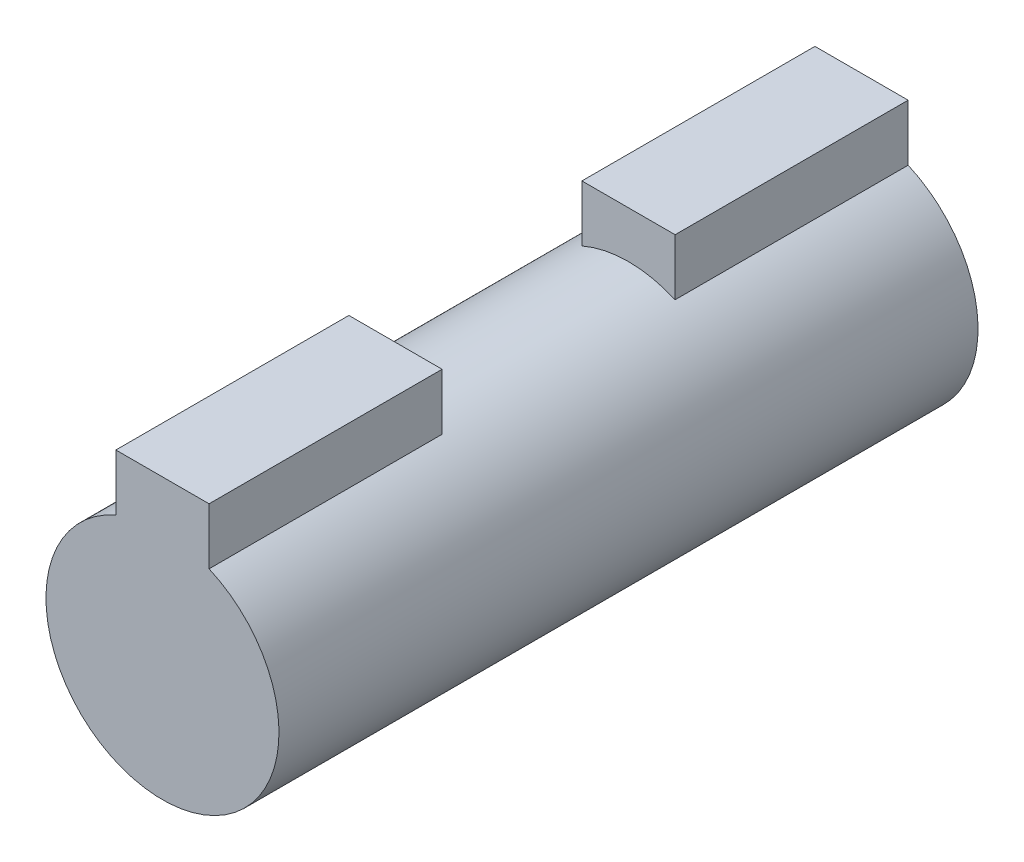
ISO-10303-21;
HEADER;
FILE_DESCRIPTION(('STEP AP214'),'2;1');
FILE_NAME('part.step','',(''),(''),'','','');
FILE_SCHEMA(('AUTOMOTIVE_DESIGN { 1 0 10303 214 1 1 1 1 }'));
ENDSEC;
DATA;
#1=APPLICATION_CONTEXT('core data for automotive mechanical design processes');
#2=APPLICATION_PROTOCOL_DEFINITION('international standard','automotive_design',2000,#1);
#3=PRODUCT_CONTEXT('',#1,'mechanical');
#4=PRODUCT('Part','Part','',(#3));
#5=PRODUCT_RELATED_PRODUCT_CATEGORY('part','',(#4));
#6=PRODUCT_DEFINITION_FORMATION('','',#4);
#7=PRODUCT_DEFINITION_CONTEXT('part definition',#1,'design');
#8=PRODUCT_DEFINITION('design','',#6,#7);
#9=PRODUCT_DEFINITION_SHAPE('','',#8);
#10=(LENGTH_UNIT() NAMED_UNIT(*) SI_UNIT(.MILLI.,.METRE.));
#11=(NAMED_UNIT(*) PLANE_ANGLE_UNIT() SI_UNIT($,.RADIAN.));
#12=(NAMED_UNIT(*) SI_UNIT($,.STERADIAN.) SOLID_ANGLE_UNIT());
#13=UNCERTAINTY_MEASURE_WITH_UNIT(LENGTH_MEASURE(1.E-05),#10,'distance_accuracy_value','');
#14=(GEOMETRIC_REPRESENTATION_CONTEXT(3) GLOBAL_UNCERTAINTY_ASSIGNED_CONTEXT((#13)) GLOBAL_UNIT_ASSIGNED_CONTEXT((#10,
#11,#12)) REPRESENTATION_CONTEXT('',''));
#15=CARTESIAN_POINT('',(0.,0.,0.));
#16=DIRECTION('',(0.,0.,1.));
#17=DIRECTION('',(1.,0.,0.));
#18=AXIS2_PLACEMENT_3D('',#15,#16,#17);
#19=CARTESIAN_POINT('',(2.,0.,30.));
#20=DIRECTION('',(1.,0.,0.));
#21=DIRECTION('',(0.,0.,-1.));
#22=AXIS2_PLACEMENT_3D('',#19,#20,#21);
#23=PLANE('',#22);
#24=DIRECTION('',(0.,0.,-1.));
#25=VECTOR('',#24,1.);
#26=CARTESIAN_POINT('',(2.,7.,30.));
#27=LINE('',#26,#25);
#28=CARTESIAN_POINT('',(2.,7.,9.99999999999999));
#29=VERTEX_POINT('',#28);
#30=CARTESIAN_POINT('',(2.,7.,0.));
#31=VERTEX_POINT('',#30);
#32=EDGE_CURVE('E122',#29,#31,#27,.T.);
#33=ORIENTED_EDGE('',*,*,#32,.F.);
#34=DIRECTION('',(0.,-1.,0.));
#35=VECTOR('',#34,1.);
#36=CARTESIAN_POINT('',(2.,0.,9.99999999999999));
#37=LINE('',#36,#35);
#38=CARTESIAN_POINT('',(2.,4.58257569495584,10.));
#39=VERTEX_POINT('',#38);
#40=EDGE_CURVE('E112',#29,#39,#37,.T.);
#41=ORIENTED_EDGE('',*,*,#40,.T.);
#42=DIRECTION('',(0.,0.,-1.));
#43=VECTOR('',#42,1.);
#44=CARTESIAN_POINT('',(2.,4.58257569495584,30.));
#45=LINE('',#44,#43);
#46=CARTESIAN_POINT('',(2.,4.58257569495584,0.));
#47=VERTEX_POINT('',#46);
#48=EDGE_CURVE('E121',#39,#47,#45,.T.);
#49=ORIENTED_EDGE('',*,*,#48,.T.);
#50=DIRECTION('',(0.,-1.,0.));
#51=VECTOR('',#50,1.);
#52=CARTESIAN_POINT('',(2.,0.,0.));
#53=LINE('',#52,#51);
#54=EDGE_CURVE('E157',#31,#47,#53,.T.);
#55=ORIENTED_EDGE('',*,*,#54,.F.);
#56=EDGE_LOOP('',(#33,#41,#49,#55));
#57=FACE_BOUND('',#56,.T.);
#58=ADVANCED_FACE('F39',(#57),#23,.T.);
#59=CARTESIAN_POINT('',(0.,7.,30.));
#60=DIRECTION('',(0.,1.,0.));
#61=DIRECTION('',(-1.,0.,0.));
#62=AXIS2_PLACEMENT_3D('',#59,#60,#61);
#63=PLANE('',#62);
#64=DIRECTION('',(0.,0.,-1.));
#65=VECTOR('',#64,1.);
#66=CARTESIAN_POINT('',(-2.,7.,30.));
#67=LINE('',#66,#65);
#68=CARTESIAN_POINT('',(-2.,7.,9.99999999999999));
#69=VERTEX_POINT('',#68);
#70=CARTESIAN_POINT('',(-2.,7.,0.));
#71=VERTEX_POINT('',#70);
#72=EDGE_CURVE('E146',#69,#71,#67,.T.);
#73=ORIENTED_EDGE('',*,*,#72,.F.);
#74=DIRECTION('',(1.,0.,0.));
#75=VECTOR('',#74,1.);
#76=CARTESIAN_POINT('',(0.,7.,9.99999999999999));
#77=LINE('',#76,#75);
#78=EDGE_CURVE('E124',#69,#29,#77,.T.);
#79=ORIENTED_EDGE('',*,*,#78,.T.);
#80=ORIENTED_EDGE('',*,*,#32,.T.);
#81=DIRECTION('',(1.,0.,0.));
#82=VECTOR('',#81,1.);
#83=CARTESIAN_POINT('',(0.,7.,0.));
#84=LINE('',#83,#82);
#85=EDGE_CURVE('E156',#71,#31,#84,.T.);
#86=ORIENTED_EDGE('',*,*,#85,.F.);
#87=EDGE_LOOP('',(#73,#79,#80,#86));
#88=FACE_BOUND('',#87,.T.);
#89=ADVANCED_FACE('F154',(#88),#63,.T.);
#90=CARTESIAN_POINT('',(-2.,0.,30.));
#91=DIRECTION('',(1.,0.,0.));
#92=DIRECTION('',(0.,0.,-1.));
#93=AXIS2_PLACEMENT_3D('',#90,#91,#92);
#94=PLANE('',#93);
#95=DIRECTION('',(0.,-1.,0.));
#96=VECTOR('',#95,1.);
#97=CARTESIAN_POINT('',(-2.,0.,9.99999999999999));
#98=LINE('',#97,#96);
#99=CARTESIAN_POINT('',(-2.,4.58257569495584,9.99999999999999));
#100=VERTEX_POINT('',#99);
#101=EDGE_CURVE('E11',#69,#100,#98,.T.);
#102=ORIENTED_EDGE('',*,*,#101,.F.);
#103=ORIENTED_EDGE('',*,*,#72,.T.);
#104=DIRECTION('',(0.,-1.,0.));
#105=VECTOR('',#104,1.);
#106=CARTESIAN_POINT('',(-2.,0.,0.));
#107=LINE('',#106,#105);
#108=CARTESIAN_POINT('',(-2.,4.58257569495584,0.));
#109=VERTEX_POINT('',#108);
#110=EDGE_CURVE('E149',#71,#109,#107,.T.);
#111=ORIENTED_EDGE('',*,*,#110,.T.);
#112=DIRECTION('',(0.,0.,-1.));
#113=VECTOR('',#112,1.);
#114=CARTESIAN_POINT('',(-2.,4.58257569495584,30.));
#115=LINE('',#114,#113);
#116=EDGE_CURVE('E82',#100,#109,#115,.T.);
#117=ORIENTED_EDGE('',*,*,#116,.F.);
#118=EDGE_LOOP('',(#102,#103,#111,#117));
#119=FACE_BOUND('',#118,.T.);
#120=ADVANCED_FACE('F191',(#119),#94,.F.);
#121=CARTESIAN_POINT('',(0.,0.,30.));
#122=DIRECTION('',(0.,0.,-1.));
#123=DIRECTION('',(-1.,0.,0.));
#124=AXIS2_PLACEMENT_3D('',#121,#122,#123);
#125=CYLINDRICAL_SURFACE('',#124,5.);
#126=CARTESIAN_POINT('',(-2.,4.58257569495584,30.));
#127=VERTEX_POINT('',#126);
#128=CARTESIAN_POINT('',(-2.,4.58257569495584,20.));
#129=VERTEX_POINT('',#128);
#130=EDGE_CURVE('E140',#127,#129,#115,.T.);
#131=ORIENTED_EDGE('',*,*,#130,.T.);
#132=CARTESIAN_POINT('',(0.,0.,20.));
#133=DIRECTION('',(0.,0.,1.));
#134=DIRECTION('',(1.,0.,0.));
#135=AXIS2_PLACEMENT_3D('',#132,#133,#134);
#136=CIRCLE('',#135,5.);
#137=CARTESIAN_POINT('',(2.,4.58257569495584,20.));
#138=VERTEX_POINT('',#137);
#139=EDGE_CURVE('E116',#138,#129,#136,.T.);
#140=ORIENTED_EDGE('',*,*,#139,.F.);
#141=CARTESIAN_POINT('',(2.,4.58257569495584,30.));
#142=VERTEX_POINT('',#141);
#143=EDGE_CURVE('E128',#142,#138,#45,.T.);
#144=ORIENTED_EDGE('',*,*,#143,.F.);
#145=CARTESIAN_POINT('',(0.,0.,30.));
#146=DIRECTION('',(0.,0.,1.));
#147=DIRECTION('',(1.,0.,0.));
#148=AXIS2_PLACEMENT_3D('',#145,#146,#147);
#149=CIRCLE('',#148,5.);
#150=EDGE_CURVE('E87',#127,#142,#149,.T.);
#151=ORIENTED_EDGE('',*,*,#150,.F.);
#152=EDGE_LOOP('',(#131,#140,#144,#151));
#153=FACE_BOUND('',#152,.T.);
#154=CARTESIAN_POINT('',(0.,0.,10.));
#155=DIRECTION('',(0.,0.,1.));
#156=DIRECTION('',(1.,0.,0.));
#157=AXIS2_PLACEMENT_3D('',#154,#155,#156);
#158=CIRCLE('',#157,5.);
#159=EDGE_CURVE('E54',#39,#100,#158,.T.);
#160=ORIENTED_EDGE('',*,*,#159,.T.);
#161=ORIENTED_EDGE('',*,*,#116,.T.);
#162=CARTESIAN_POINT('',(0.,0.,0.));
#163=DIRECTION('',(0.,0.,1.));
#164=DIRECTION('',(1.,0.,0.));
#165=AXIS2_PLACEMENT_3D('',#162,#163,#164);
#166=CIRCLE('',#165,5.);
#167=EDGE_CURVE('E123',#109,#47,#166,.T.);
#168=ORIENTED_EDGE('',*,*,#167,.T.);
#169=ORIENTED_EDGE('',*,*,#48,.F.);
#170=EDGE_LOOP('',(#160,#161,#168,#169));
#171=FACE_BOUND('',#170,.T.);
#172=ADVANCED_FACE('F41',(#153,#171),#125,.T.);
#173=DIRECTION('',(0.,-1.,0.));
#174=VECTOR('',#173,1.);
#175=CARTESIAN_POINT('',(2.,0.,20.));
#176=LINE('',#175,#174);
#177=CARTESIAN_POINT('',(2.,7.,20.));
#178=VERTEX_POINT('',#177);
#179=EDGE_CURVE('E173',#178,#138,#176,.T.);
#180=ORIENTED_EDGE('',*,*,#179,.F.);
#181=CARTESIAN_POINT('',(2.,7.,30.));
#182=VERTEX_POINT('',#181);
#183=EDGE_CURVE('E129',#182,#178,#27,.T.);
#184=ORIENTED_EDGE('',*,*,#183,.F.);
#185=DIRECTION('',(0.,-1.,0.));
#186=VECTOR('',#185,1.);
#187=CARTESIAN_POINT('',(2.,0.,30.));
#188=LINE('',#187,#186);
#189=EDGE_CURVE('E168',#182,#142,#188,.T.);
#190=ORIENTED_EDGE('',*,*,#189,.T.);
#191=ORIENTED_EDGE('',*,*,#143,.T.);
#192=EDGE_LOOP('',(#180,#184,#190,#191));
#193=FACE_BOUND('',#192,.T.);
#194=ADVANCED_FACE('F179',(#193),#23,.T.);
#195=DIRECTION('',(1.,0.,0.));
#196=VECTOR('',#195,1.);
#197=CARTESIAN_POINT('',(0.,7.,20.));
#198=LINE('',#197,#196);
#199=CARTESIAN_POINT('',(-2.,7.,20.));
#200=VERTEX_POINT('',#199);
#201=EDGE_CURVE('E115',#200,#178,#198,.T.);
#202=ORIENTED_EDGE('',*,*,#201,.F.);
#203=CARTESIAN_POINT('',(-2.,7.,30.));
#204=VERTEX_POINT('',#203);
#205=EDGE_CURVE('E141',#204,#200,#67,.T.);
#206=ORIENTED_EDGE('',*,*,#205,.F.);
#207=DIRECTION('',(1.,0.,0.));
#208=VECTOR('',#207,1.);
#209=CARTESIAN_POINT('',(0.,7.,30.));
#210=LINE('',#209,#208);
#211=EDGE_CURVE('E165',#204,#182,#210,.T.);
#212=ORIENTED_EDGE('',*,*,#211,.T.);
#213=ORIENTED_EDGE('',*,*,#183,.T.);
#214=EDGE_LOOP('',(#202,#206,#212,#213));
#215=FACE_BOUND('',#214,.T.);
#216=ADVANCED_FACE('F181',(#215),#63,.T.);
#217=ORIENTED_EDGE('',*,*,#205,.T.);
#218=DIRECTION('',(0.,-1.,0.));
#219=VECTOR('',#218,1.);
#220=CARTESIAN_POINT('',(-2.,0.,20.));
#221=LINE('',#220,#219);
#222=EDGE_CURVE('E47',#200,#129,#221,.T.);
#223=ORIENTED_EDGE('',*,*,#222,.T.);
#224=ORIENTED_EDGE('',*,*,#130,.F.);
#225=DIRECTION('',(0.,-1.,0.));
#226=VECTOR('',#225,1.);
#227=CARTESIAN_POINT('',(-2.,0.,30.));
#228=LINE('',#227,#226);
#229=EDGE_CURVE('E62',#204,#127,#228,.T.);
#230=ORIENTED_EDGE('',*,*,#229,.F.);
#231=EDGE_LOOP('',(#217,#223,#224,#230));
#232=FACE_BOUND('',#231,.T.);
#233=ADVANCED_FACE('F139',(#232),#94,.F.);
#234=CARTESIAN_POINT('',(0.,0.,30.));
#235=DIRECTION('',(0.,0.,1.));
#236=DIRECTION('',(1.,0.,0.));
#237=AXIS2_PLACEMENT_3D('',#234,#235,#236);
#238=PLANE('',#237);
#239=ORIENTED_EDGE('',*,*,#150,.T.);
#240=ORIENTED_EDGE('',*,*,#189,.F.);
#241=ORIENTED_EDGE('',*,*,#211,.F.);
#242=ORIENTED_EDGE('',*,*,#229,.T.);
#243=EDGE_LOOP('',(#239,#240,#241,#242));
#244=FACE_BOUND('',#243,.T.);
#245=ADVANCED_FACE('F182',(#244),#238,.T.);
#246=CARTESIAN_POINT('',(0.,0.,0.));
#247=DIRECTION('',(0.,0.,1.));
#248=DIRECTION('',(1.,0.,0.));
#249=AXIS2_PLACEMENT_3D('',#246,#247,#248);
#250=PLANE('',#249);
#251=ORIENTED_EDGE('',*,*,#167,.F.);
#252=ORIENTED_EDGE('',*,*,#110,.F.);
#253=ORIENTED_EDGE('',*,*,#85,.T.);
#254=ORIENTED_EDGE('',*,*,#54,.T.);
#255=EDGE_LOOP('',(#251,#252,#253,#254));
#256=FACE_BOUND('',#255,.T.);
#257=ADVANCED_FACE('F161',(#256),#250,.F.);
#258=CARTESIAN_POINT('',(0.,0.,10.));
#259=DIRECTION('',(0.,0.,1.));
#260=DIRECTION('',(1.,0.,0.));
#261=AXIS2_PLACEMENT_3D('',#258,#259,#260);
#262=PLANE('',#261);
#263=ORIENTED_EDGE('',*,*,#78,.F.);
#264=ORIENTED_EDGE('',*,*,#101,.T.);
#265=ORIENTED_EDGE('',*,*,#159,.F.);
#266=ORIENTED_EDGE('',*,*,#40,.F.);
#267=EDGE_LOOP('',(#263,#264,#265,#266));
#268=FACE_BOUND('',#267,.T.);
#269=ADVANCED_FACE('F111',(#268),#262,.T.);
#270=CARTESIAN_POINT('',(0.,0.,20.));
#271=DIRECTION('',(0.,0.,1.));
#272=DIRECTION('',(1.,0.,0.));
#273=AXIS2_PLACEMENT_3D('',#270,#271,#272);
#274=PLANE('',#273);
#275=ORIENTED_EDGE('',*,*,#179,.T.);
#276=ORIENTED_EDGE('',*,*,#139,.T.);
#277=ORIENTED_EDGE('',*,*,#222,.F.);
#278=ORIENTED_EDGE('',*,*,#201,.T.);
#279=EDGE_LOOP('',(#275,#276,#277,#278));
#280=FACE_BOUND('',#279,.T.);
#281=ADVANCED_FACE('F176',(#280),#274,.F.);
#282=CLOSED_SHELL('',(#58,#89,#120,#172,#194,#216,#233,#245,#257,#269,#281));
#283=MANIFOLD_SOLID_BREP('B2',#282);
#284=ADVANCED_BREP_SHAPE_REPRESENTATION('',(#18,#283),#14);
#285=SHAPE_DEFINITION_REPRESENTATION(#9,#284);
ENDSEC;
END-ISO-10303-21;
